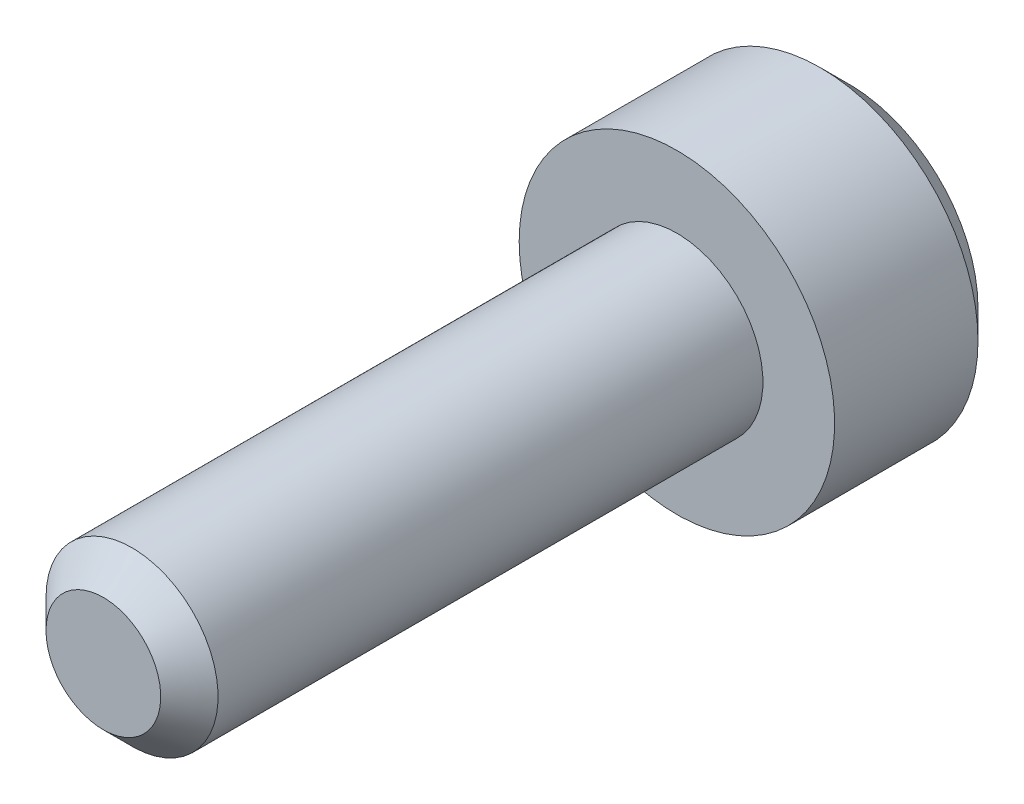
ISO-10303-21;
HEADER;
FILE_DESCRIPTION(('STEP AP214'),'2;1');
FILE_NAME('part.step','',(''),(''),'','','');
FILE_SCHEMA(('AUTOMOTIVE_DESIGN { 1 0 10303 214 1 1 1 1 }'));
ENDSEC;
DATA;
#1=APPLICATION_CONTEXT('core data for automotive mechanical design processes');
#2=APPLICATION_PROTOCOL_DEFINITION('international standard','automotive_design',2000,#1);
#3=PRODUCT_CONTEXT('',#1,'mechanical');
#4=PRODUCT('Part','Part','',(#3));
#5=PRODUCT_RELATED_PRODUCT_CATEGORY('part','',(#4));
#6=PRODUCT_DEFINITION_FORMATION('','',#4);
#7=PRODUCT_DEFINITION_CONTEXT('part definition',#1,'design');
#8=PRODUCT_DEFINITION('design','',#6,#7);
#9=PRODUCT_DEFINITION_SHAPE('','',#8);
#10=(LENGTH_UNIT() NAMED_UNIT(*) SI_UNIT(.MILLI.,.METRE.));
#11=(NAMED_UNIT(*) PLANE_ANGLE_UNIT() SI_UNIT($,.RADIAN.));
#12=(NAMED_UNIT(*) SI_UNIT($,.STERADIAN.) SOLID_ANGLE_UNIT());
#13=UNCERTAINTY_MEASURE_WITH_UNIT(LENGTH_MEASURE(1.E-05),#10,'distance_accuracy_value','');
#14=(GEOMETRIC_REPRESENTATION_CONTEXT(3) GLOBAL_UNCERTAINTY_ASSIGNED_CONTEXT((#13)) GLOBAL_UNIT_ASSIGNED_CONTEXT((#10,
#11,#12)) REPRESENTATION_CONTEXT('',''));
#15=CARTESIAN_POINT('',(0.,0.,0.));
#16=DIRECTION('',(0.,0.,1.));
#17=DIRECTION('',(1.,0.,0.));
#18=AXIS2_PLACEMENT_3D('',#15,#16,#17);
#19=CARTESIAN_POINT('',(1.299038106,-0.75,0.));
#20=DIRECTION('',(-0.499999999906659,0.866025403838329,0.));
#21=DIRECTION('',(-0.866025403838329,-0.499999999906659,0.));
#22=AXIS2_PLACEMENT_3D('',#19,#20,#21);
#23=PLANE('',#22);
#24=DIRECTION('',(-0.866025403838329,-0.499999999906659,0.));
#25=VECTOR('',#24,1.);
#26=CARTESIAN_POINT('',(1.299038106,-0.75,-0.5));
#27=LINE('',#26,#25);
#28=CARTESIAN_POINT('',(1.299038105976,-0.750000000119229,-0.5));
#29=VERTEX_POINT('',#28);
#30=CARTESIAN_POINT('',(-2.50382640975994E-10,-1.50000000001441,-0.5));
#31=VERTEX_POINT('',#30);
#32=EDGE_CURVE('E66',#29,#31,#27,.T.);
#33=ORIENTED_EDGE('',*,*,#32,.T.);
#34=DIRECTION('',(0.,0.,1.));
#35=VECTOR('',#34,1.);
#36=CARTESIAN_POINT('',(-7.26184373535166E-10,-1.49999999958074,0.));
#37=LINE('',#36,#35);
#38=CARTESIAN_POINT('',(-4.31928983609548E-10,-1.49999999983011,1.5));
#39=VERTEX_POINT('',#38);
#40=EDGE_CURVE('E71',#39,#31,#37,.F.);
#41=ORIENTED_EDGE('',*,*,#40,.F.);
#42=DIRECTION('',(-0.866025403838329,-0.499999999906659,0.));
#43=VECTOR('',#42,1.);
#44=CARTESIAN_POINT('',(1.299038106,-0.75,1.5));
#45=LINE('',#44,#43);
#46=CARTESIAN_POINT('',(1.299038106,-0.750000000039743,1.5));
#47=VERTEX_POINT('',#46);
#48=EDGE_CURVE('E76',#39,#47,#45,.F.);
#49=ORIENTED_EDGE('',*,*,#48,.T.);
#50=DIRECTION('',(0.,0.,1.));
#51=VECTOR('',#50,1.);
#52=CARTESIAN_POINT('',(1.299038106,-0.750000000158972,0.));
#53=LINE('',#52,#51);
#54=EDGE_CURVE('E74',#29,#47,#53,.T.);
#55=ORIENTED_EDGE('',*,*,#54,.F.);
#56=EDGE_LOOP('',(#33,#41,#49,#55));
#57=FACE_BOUND('',#56,.T.);
#58=ADVANCED_FACE('F17',(#57),#23,.T.);
#59=CARTESIAN_POINT('',(0.,-1.5,0.));
#60=DIRECTION('',(0.499999999906659,0.866025403838329,0.));
#61=DIRECTION('',(-0.866025403838329,0.499999999906659,0.));
#62=AXIS2_PLACEMENT_3D('',#59,#60,#61);
#63=PLANE('',#62);
#64=DIRECTION('',(-0.866025403838329,0.499999999906659,0.));
#65=VECTOR('',#64,1.);
#66=CARTESIAN_POINT('',(0.,-1.5,-0.5));
#67=LINE('',#66,#65);
#68=CARTESIAN_POINT('',(-1.29903810593558,-0.750000000070006,-0.5));
#69=VERTEX_POINT('',#68);
#70=EDGE_CURVE('E79',#31,#69,#67,.T.);
#71=ORIENTED_EDGE('',*,*,#70,.T.);
#72=DIRECTION('',(0.,0.,-1.));
#73=VECTOR('',#72,1.);
#74=CARTESIAN_POINT('',(-1.299038106,-0.75,0.));
#75=LINE('',#74,#73);
#76=CARTESIAN_POINT('',(-1.29903810597379,-0.750000000015132,1.5));
#77=VERTEX_POINT('',#76);
#78=EDGE_CURVE('E127',#77,#69,#75,.T.);
#79=ORIENTED_EDGE('',*,*,#78,.F.);
#80=DIRECTION('',(0.866025403838329,-0.499999999906659,0.));
#81=VECTOR('',#80,1.);
#82=CARTESIAN_POINT('',(-1.299038106,-0.75,1.5));
#83=LINE('',#82,#81);
#84=EDGE_CURVE('E89',#77,#39,#83,.T.);
#85=ORIENTED_EDGE('',*,*,#84,.T.);
#86=ORIENTED_EDGE('',*,*,#40,.T.);
#87=EDGE_LOOP('',(#71,#79,#85,#86));
#88=FACE_BOUND('',#87,.T.);
#89=ADVANCED_FACE('F88',(#88),#63,.T.);
#90=CARTESIAN_POINT('',(1.299038106,0.75,0.));
#91=DIRECTION('',(-1.,0.,0.));
#92=DIRECTION('',(0.,0.,1.));
#93=AXIS2_PLACEMENT_3D('',#90,#91,#92);
#94=PLANE('',#93);
#95=DIRECTION('',(0.,1.,0.));
#96=VECTOR('',#95,1.);
#97=CARTESIAN_POINT('',(1.299038106,0.75,-0.5));
#98=LINE('',#97,#96);
#99=CARTESIAN_POINT('',(1.29903810594979,0.750000000094617,-0.5));
#100=VERTEX_POINT('',#99);
#101=EDGE_CURVE('E86',#100,#29,#98,.F.);
#102=ORIENTED_EDGE('',*,*,#101,.T.);
#103=ORIENTED_EDGE('',*,*,#54,.T.);
#104=DIRECTION('',(0.,1.,0.));
#105=VECTOR('',#104,1.);
#106=CARTESIAN_POINT('',(1.299038106,-1.5,1.5));
#107=LINE('',#106,#105);
#108=CARTESIAN_POINT('',(1.29903810597379,0.750000000015131,1.5));
#109=VERTEX_POINT('',#108);
#110=EDGE_CURVE('E133',#47,#109,#107,.T.);
#111=ORIENTED_EDGE('',*,*,#110,.T.);
#112=DIRECTION('',(0.,0.,1.));
#113=VECTOR('',#112,1.);
#114=CARTESIAN_POINT('',(1.29903810589517,0.750000000060525,0.));
#115=LINE('',#114,#113);
#116=EDGE_CURVE('E119',#100,#109,#115,.T.);
#117=ORIENTED_EDGE('',*,*,#116,.F.);
#118=EDGE_LOOP('',(#102,#103,#111,#117));
#119=FACE_BOUND('',#118,.T.);
#120=ADVANCED_FACE('F137',(#119),#94,.T.);
#121=CARTESIAN_POINT('',(-1.299038106,-1.5,1.5));
#122=DIRECTION('',(0.,0.,1.));
#123=DIRECTION('',(1.,0.,0.));
#124=AXIS2_PLACEMENT_3D('',#121,#122,#123);
#125=PLANE('',#124);
#126=ORIENTED_EDGE('',*,*,#84,.F.);
#127=DIRECTION('',(0.,1.,0.));
#128=VECTOR('',#127,1.);
#129=CARTESIAN_POINT('',(-1.299038106,-0.75,1.5));
#130=LINE('',#129,#128);
#131=CARTESIAN_POINT('',(-1.299038106,0.750000000039743,1.5));
#132=VERTEX_POINT('',#131);
#133=EDGE_CURVE('E129',#132,#77,#130,.F.);
#134=ORIENTED_EDGE('',*,*,#133,.F.);
#135=DIRECTION('',(0.866025403838329,0.499999999906659,0.));
#136=VECTOR('',#135,1.);
#137=CARTESIAN_POINT('',(-1.299038106,0.75,1.5));
#138=LINE('',#137,#136);
#139=CARTESIAN_POINT('',(5.79056783732717E-10,1.49999999970542,1.5));
#140=VERTEX_POINT('',#139);
#141=EDGE_CURVE('E116',#140,#132,#138,.F.);
#142=ORIENTED_EDGE('',*,*,#141,.F.);
#143=DIRECTION('',(0.866025403838329,-0.499999999906659,0.));
#144=VECTOR('',#143,1.);
#145=CARTESIAN_POINT('',(0.,1.5,1.5));
#146=LINE('',#145,#144);
#147=EDGE_CURVE('E123',#109,#140,#146,.F.);
#148=ORIENTED_EDGE('',*,*,#147,.F.);
#149=ORIENTED_EDGE('',*,*,#110,.F.);
#150=ORIENTED_EDGE('',*,*,#48,.F.);
#151=EDGE_LOOP('',(#126,#134,#142,#148,#149,#150));
#152=FACE_BOUND('',#151,.T.);
#153=ADVANCED_FACE('F149',(#152),#125,.F.);
#154=CARTESIAN_POINT('',(-1.299038106,-0.75,0.));
#155=DIRECTION('',(1.,0.,0.));
#156=DIRECTION('',(0.,0.,-1.));
#157=AXIS2_PLACEMENT_3D('',#154,#155,#156);
#158=PLANE('',#157);
#159=DIRECTION('',(0.,1.,0.));
#160=VECTOR('',#159,1.);
#161=CARTESIAN_POINT('',(-1.299038106,-0.75,-0.5));
#162=LINE('',#161,#160);
#163=CARTESIAN_POINT('',(-1.299038105988,0.75000000011923,-0.5));
#164=VERTEX_POINT('',#163);
#165=EDGE_CURVE('E82',#69,#164,#162,.T.);
#166=ORIENTED_EDGE('',*,*,#165,.T.);
#167=DIRECTION('',(0.,0.,1.));
#168=VECTOR('',#167,1.);
#169=CARTESIAN_POINT('',(-1.299038106,0.75,0.));
#170=LINE('',#169,#168);
#171=EDGE_CURVE('E113',#132,#164,#170,.F.);
#172=ORIENTED_EDGE('',*,*,#171,.F.);
#173=ORIENTED_EDGE('',*,*,#133,.T.);
#174=ORIENTED_EDGE('',*,*,#78,.T.);
#175=EDGE_LOOP('',(#166,#172,#173,#174));
#176=FACE_BOUND('',#175,.T.);
#177=ADVANCED_FACE('F147',(#176),#158,.T.);
#178=CARTESIAN_POINT('',(0.,1.5,0.));
#179=DIRECTION('',(-0.499999999906659,-0.866025403838329,0.));
#180=DIRECTION('',(0.866025403838329,-0.499999999906659,0.));
#181=AXIS2_PLACEMENT_3D('',#178,#179,#180);
#182=PLANE('',#181);
#183=DIRECTION('',(0.866025403838329,-0.499999999906659,0.));
#184=VECTOR('',#183,1.);
#185=CARTESIAN_POINT('',(0.,1.5,-0.5));
#186=LINE('',#185,#184);
#187=CARTESIAN_POINT('',(3.97510532185607E-10,1.49999999988973,-0.5));
#188=VERTEX_POINT('',#187);
#189=EDGE_CURVE('E35',#188,#100,#186,.T.);
#190=ORIENTED_EDGE('',*,*,#189,.T.);
#191=ORIENTED_EDGE('',*,*,#116,.T.);
#192=ORIENTED_EDGE('',*,*,#147,.T.);
#193=DIRECTION('',(0.,0.,1.));
#194=VECTOR('',#193,1.);
#195=CARTESIAN_POINT('',(1.37673726585685E-10,1.50000000007949,0.));
#196=LINE('',#195,#194);
#197=EDGE_CURVE('E110',#188,#140,#196,.T.);
#198=ORIENTED_EDGE('',*,*,#197,.F.);
#199=EDGE_LOOP('',(#190,#191,#192,#198));
#200=FACE_BOUND('',#199,.T.);
#201=ADVANCED_FACE('F141',(#200),#182,.T.);
#202=CARTESIAN_POINT('',(-1.299038106,0.75,0.));
#203=DIRECTION('',(0.499999999906659,-0.866025403838329,0.));
#204=DIRECTION('',(0.866025403838329,0.499999999906659,0.));
#205=AXIS2_PLACEMENT_3D('',#202,#203,#204);
#206=PLANE('',#205);
#207=DIRECTION('',(-0.866025403784439,-0.5,0.));
#208=VECTOR('',#207,1.);
#209=CARTESIAN_POINT('',(0.,1.50000000031794,-0.5));
#210=LINE('',#209,#208);
#211=EDGE_CURVE('E106',#188,#164,#210,.T.);
#212=ORIENTED_EDGE('',*,*,#211,.F.);
#213=ORIENTED_EDGE('',*,*,#197,.T.);
#214=ORIENTED_EDGE('',*,*,#141,.T.);
#215=ORIENTED_EDGE('',*,*,#171,.T.);
#216=EDGE_LOOP('',(#212,#213,#214,#215));
#217=FACE_BOUND('',#216,.T.);
#218=ADVANCED_FACE('F144',(#217),#206,.T.);
#219=CARTESIAN_POINT('',(0.,0.,-0.5));
#220=DIRECTION('',(0.,0.,-1.));
#221=DIRECTION('',(-1.,0.,0.));
#222=AXIS2_PLACEMENT_3D('',#219,#220,#221);
#223=PLANE('',#222);
#224=ORIENTED_EDGE('',*,*,#189,.F.);
#225=ORIENTED_EDGE('',*,*,#211,.T.);
#226=ORIENTED_EDGE('',*,*,#165,.F.);
#227=ORIENTED_EDGE('',*,*,#70,.F.);
#228=ORIENTED_EDGE('',*,*,#32,.F.);
#229=ORIENTED_EDGE('',*,*,#101,.F.);
#230=EDGE_LOOP('',(#224,#225,#226,#227,#228,#229));
#231=FACE_BOUND('',#230,.T.);
#232=CARTESIAN_POINT('',(0.,0.,-0.499999999988177));
#233=DIRECTION('',(0.,0.,1.));
#234=DIRECTION('',(1.,0.,0.));
#235=AXIS2_PLACEMENT_3D('',#232,#233,#234);
#236=CIRCLE('',#235,2.25000000000364);
#237=CARTESIAN_POINT('',(2.25000000000364,0.,-0.499999999988177));
#238=VERTEX_POINT('',#237);
#239=EDGE_CURVE('E20',#238,#238,#236,.T.);
#240=ORIENTED_EDGE('',*,*,#239,.F.);
#241=EDGE_LOOP('',(#240));
#242=FACE_BOUND('',#241,.T.);
#243=ADVANCED_FACE('F80',(#231,#242),#223,.T.);
#244=CARTESIAN_POINT('',(0.,0.,0.));
#245=DIRECTION('',(0.,0.,1.));
#246=DIRECTION('',(1.,0.,0.));
#247=AXIS2_PLACEMENT_3D('',#244,#245,#246);
#248=CONICAL_SURFACE('',#247,2.74999999999181,0.785398163397448);
#249=ORIENTED_EDGE('',*,*,#239,.T.);
#250=EDGE_LOOP('',(#249));
#251=FACE_BOUND('',#250,.T.);
#252=CARTESIAN_POINT('',(0.,0.,0.));
#253=DIRECTION('',(0.,0.,-1.));
#254=DIRECTION('',(-1.,0.,0.));
#255=AXIS2_PLACEMENT_3D('',#252,#253,#254);
#256=CIRCLE('',#255,2.75);
#257=CARTESIAN_POINT('',(-2.75,0.,0.));
#258=VERTEX_POINT('',#257);
#259=EDGE_CURVE('E98',#258,#258,#256,.F.);
#260=ORIENTED_EDGE('',*,*,#259,.F.);
#261=EDGE_LOOP('',(#260));
#262=FACE_BOUND('',#261,.T.);
#263=ADVANCED_FACE('F182',(#251,#262),#248,.T.);
#264=CARTESIAN_POINT('',(-1.518,-1.518,12.5));
#265=DIRECTION('',(0.,0.,1.));
#266=DIRECTION('',(1.,0.,0.));
#267=AXIS2_PLACEMENT_3D('',#264,#265,#266);
#268=PLANE('',#267);
#269=CARTESIAN_POINT('',(0.,0.,12.4999999999886));
#270=DIRECTION('',(0.,0.,-1.));
#271=DIRECTION('',(-1.,0.,0.));
#272=AXIS2_PLACEMENT_3D('',#269,#270,#271);
#273=CIRCLE('',#272,0.999999999976353);
#274=CARTESIAN_POINT('',(-0.999999999976353,0.,12.4999999999886));
#275=VERTEX_POINT('',#274);
#276=EDGE_CURVE('E96',#275,#275,#273,.T.);
#277=ORIENTED_EDGE('',*,*,#276,.F.);
#278=EDGE_LOOP('',(#277));
#279=FACE_BOUND('',#278,.T.);
#280=ADVANCED_FACE('F178',(#279),#268,.T.);
#281=CARTESIAN_POINT('',(0.,0.,10.278174593052));
#282=DIRECTION('',(0.,0.,-1.));
#283=DIRECTION('',(-1.,0.,0.));
#284=AXIS2_PLACEMENT_3D('',#281,#282,#283);
#285=CYLINDRICAL_SURFACE('',#284,2.75);
#286=CARTESIAN_POINT('',(0.,0.,2.5));
#287=DIRECTION('',(0.,0.,-1.));
#288=DIRECTION('',(-1.,0.,0.));
#289=AXIS2_PLACEMENT_3D('',#286,#287,#288);
#290=CIRCLE('',#289,2.75);
#291=CARTESIAN_POINT('',(-2.75,0.,2.5));
#292=VERTEX_POINT('',#291);
#293=EDGE_CURVE('E94',#292,#292,#290,.F.);
#294=ORIENTED_EDGE('',*,*,#293,.F.);
#295=EDGE_LOOP('',(#294));
#296=FACE_BOUND('',#295,.T.);
#297=ORIENTED_EDGE('',*,*,#259,.T.);
#298=EDGE_LOOP('',(#297));
#299=FACE_BOUND('',#298,.T.);
#300=ADVANCED_FACE('F174',(#296,#299),#285,.T.);
#301=CARTESIAN_POINT('',(0.,0.,11.9999999999436));
#302=DIRECTION('',(0.,0.,-1.));
#303=DIRECTION('',(-1.,0.,0.));
#304=AXIS2_PLACEMENT_3D('',#301,#302,#303);
#305=CONICAL_SURFACE('',#304,1.50000000002137,0.785398163397448);
#306=CARTESIAN_POINT('',(0.,0.,12.));
#307=DIRECTION('',(0.,0.,-1.));
#308=DIRECTION('',(-1.,0.,0.));
#309=AXIS2_PLACEMENT_3D('',#306,#307,#308);
#310=CIRCLE('',#309,1.5);
#311=CARTESIAN_POINT('',(-1.5,0.,12.));
#312=VERTEX_POINT('',#311);
#313=EDGE_CURVE('E26',#312,#312,#310,.T.);
#314=ORIENTED_EDGE('',*,*,#313,.F.);
#315=EDGE_LOOP('',(#314));
#316=FACE_BOUND('',#315,.T.);
#317=ORIENTED_EDGE('',*,*,#276,.T.);
#318=EDGE_LOOP('',(#317));
#319=FACE_BOUND('',#318,.T.);
#320=ADVANCED_FACE('F167',(#316,#319),#305,.T.);
#321=CARTESIAN_POINT('',(-1.771,-1.771,2.5));
#322=DIRECTION('',(0.,0.,1.));
#323=DIRECTION('',(1.,0.,0.));
#324=AXIS2_PLACEMENT_3D('',#321,#322,#323);
#325=PLANE('',#324);
#326=ORIENTED_EDGE('',*,*,#293,.T.);
#327=EDGE_LOOP('',(#326));
#328=FACE_BOUND('',#327,.T.);
#329=CARTESIAN_POINT('',(0.,0.,2.5));
#330=DIRECTION('',(0.,0.,-1.));
#331=DIRECTION('',(-1.,0.,0.));
#332=AXIS2_PLACEMENT_3D('',#329,#330,#331);
#333=CIRCLE('',#332,1.5);
#334=CARTESIAN_POINT('',(-1.5,0.,2.5));
#335=VERTEX_POINT('',#334);
#336=EDGE_CURVE('E11',#335,#335,#333,.F.);
#337=ORIENTED_EDGE('',*,*,#336,.F.);
#338=EDGE_LOOP('',(#337));
#339=FACE_BOUND('',#338,.T.);
#340=ADVANCED_FACE('F161',(#328,#339),#325,.T.);
#341=CARTESIAN_POINT('',(0.,0.,12.5));
#342=DIRECTION('',(0.,0.,-1.));
#343=DIRECTION('',(-1.,0.,0.));
#344=AXIS2_PLACEMENT_3D('',#341,#342,#343);
#345=CYLINDRICAL_SURFACE('',#344,1.5);
#346=ORIENTED_EDGE('',*,*,#336,.T.);
#347=EDGE_LOOP('',(#346));
#348=FACE_BOUND('',#347,.T.);
#349=ORIENTED_EDGE('',*,*,#313,.T.);
#350=EDGE_LOOP('',(#349));
#351=FACE_BOUND('',#350,.T.);
#352=ADVANCED_FACE('F159',(#348,#351),#345,.T.);
#353=CLOSED_SHELL('',(#58,#89,#120,#153,#177,#201,#218,#243,#263,#280,#300,#320,#340,#352));
#354=MANIFOLD_SOLID_BREP('B1',#353);
#355=ADVANCED_BREP_SHAPE_REPRESENTATION('',(#18,#354),#14);
#356=SHAPE_DEFINITION_REPRESENTATION(#9,#355);
ENDSEC;
END-ISO-10303-21;
